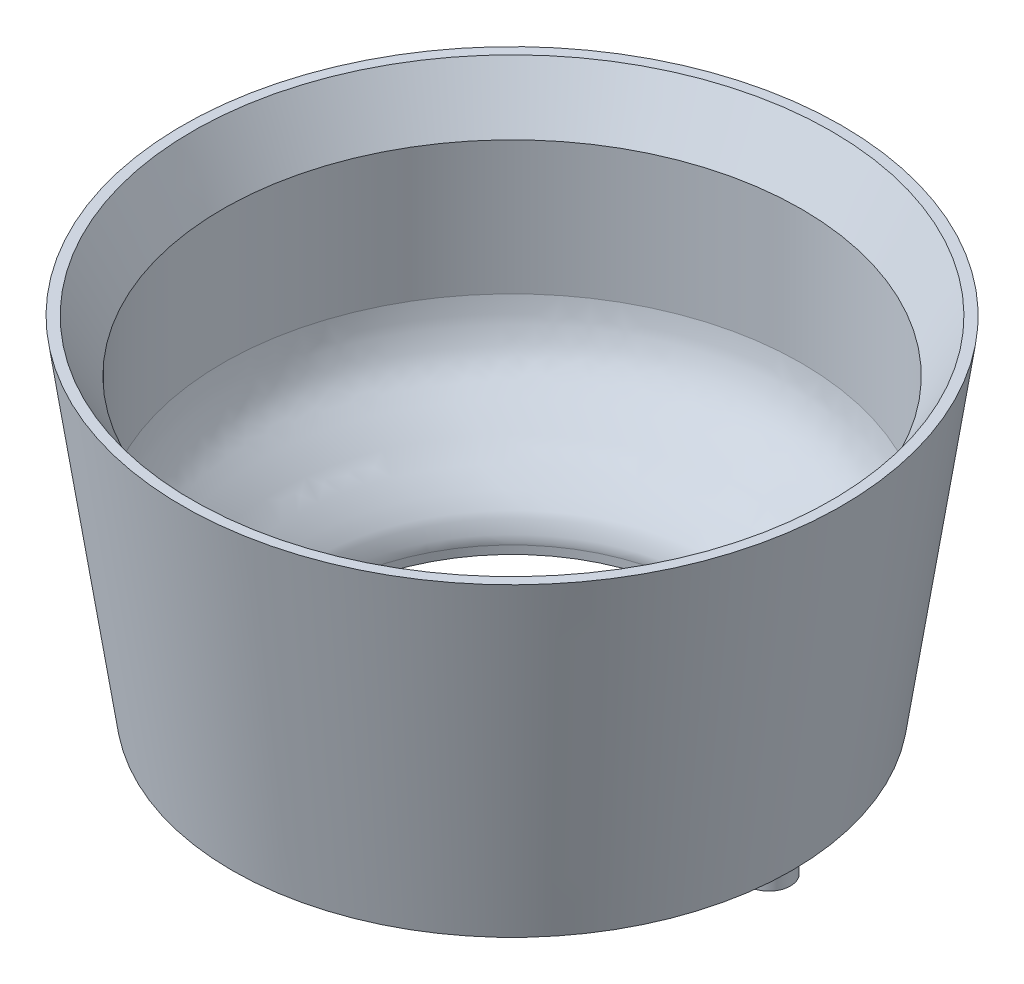
ISO-10303-21;
HEADER;
FILE_DESCRIPTION(('STEP AP214'),'2;1');
FILE_NAME('part.step','',(''),(''),'','','');
FILE_SCHEMA(('AUTOMOTIVE_DESIGN { 1 0 10303 214 1 1 1 1 }'));
ENDSEC;
DATA;
#1=APPLICATION_CONTEXT('core data for automotive mechanical design processes');
#2=APPLICATION_PROTOCOL_DEFINITION('international standard','automotive_design',2000,#1);
#3=PRODUCT_CONTEXT('',#1,'mechanical');
#4=PRODUCT('Part','Part','',(#3));
#5=PRODUCT_RELATED_PRODUCT_CATEGORY('part','',(#4));
#6=PRODUCT_DEFINITION_FORMATION('','',#4);
#7=PRODUCT_DEFINITION_CONTEXT('part definition',#1,'design');
#8=PRODUCT_DEFINITION('design','',#6,#7);
#9=PRODUCT_DEFINITION_SHAPE('','',#8);
#10=(LENGTH_UNIT() NAMED_UNIT(*) SI_UNIT(.MILLI.,.METRE.));
#11=(NAMED_UNIT(*) PLANE_ANGLE_UNIT() SI_UNIT($,.RADIAN.));
#12=(NAMED_UNIT(*) SI_UNIT($,.STERADIAN.) SOLID_ANGLE_UNIT());
#13=UNCERTAINTY_MEASURE_WITH_UNIT(LENGTH_MEASURE(1.E-05),#10,'distance_accuracy_value','');
#14=(GEOMETRIC_REPRESENTATION_CONTEXT(3) GLOBAL_UNCERTAINTY_ASSIGNED_CONTEXT((#13)) GLOBAL_UNIT_ASSIGNED_CONTEXT((#10,
#11,#12)) REPRESENTATION_CONTEXT('',''));
#15=CARTESIAN_POINT('',(0.,0.,0.));
#16=DIRECTION('',(0.,0.,1.));
#17=DIRECTION('',(1.,0.,0.));
#18=AXIS2_PLACEMENT_3D('',#15,#16,#17);
#19=CARTESIAN_POINT('',(0.,295.540718437762,-40.5476747547934));
#20=CARTESIAN_POINT('',(0.,295.012709615636,-40.4477404657415));
#21=CARTESIAN_POINT('',(0.,293.970757618623,-40.2927773525862));
#22=CARTESIAN_POINT('',(0.,292.587532752845,-39.930889754875));
#23=CARTESIAN_POINT('',(0.,291.581451359409,-39.51618641559));
#24=CARTESIAN_POINT('',(0.,290.578047280025,-39.1083707824325));
#25=CARTESIAN_POINT('',(0.,289.316986818185,-38.4396980542591));
#26=CARTESIAN_POINT('',(0.,288.032583078736,-37.3314160861705));
#27=CARTESIAN_POINT('',(0.,287.115418473763,-36.3683638812662));
#28=CARTESIAN_POINT('',(0.,286.340079672536,-35.6302312643945));
#29=CARTESIAN_POINT('',(0.,285.762737125999,-35.0164727262729));
#30=CARTESIAN_POINT('',(0.,285.247169223289,-34.3942597952709));
#31=CARTESIAN_POINT('',(0.,284.556557999368,-33.6355246615368));
#32=CARTESIAN_POINT('',(0.,283.771384037677,-32.9203613336381));
#33=CARTESIAN_POINT('',(0.,282.986073935963,-32.12965190107));
#34=CARTESIAN_POINT('',(0.,282.459482322822,-31.4852417836461));
#35=CARTESIAN_POINT('',(0.,281.963476572773,-30.9149972084707));
#36=CARTESIAN_POINT('',(0.,281.391298158875,-30.3717003462487));
#37=CARTESIAN_POINT('',(0.,280.804626849955,-29.7827961587849));
#38=CARTESIAN_POINT('',(0.,280.262154528045,-29.2275845813112));
#39=CARTESIAN_POINT('',(0.,279.674853681479,-28.7247526180959));
#40=CARTESIAN_POINT('',(0.,279.039651715273,-28.1803862534295));
#41=CARTESIAN_POINT('',(0.,278.470209991792,-27.651838315325));
#42=CARTESIAN_POINT('',(0.,277.876839186641,-27.3081459354535));
#43=CARTESIAN_POINT('',(0.,277.127164256162,-26.9952300805427));
#44=CARTESIAN_POINT('',(0.,276.164510632259,-26.5979526177344));
#45=CARTESIAN_POINT('',(0.,275.470548140668,-26.4648115829165));
#46=CARTESIAN_POINT('',(0.,274.996982716808,-26.5077562004189));
#47=B_SPLINE_CURVE_WITH_KNOTS('',3,(#19,#20,#21,#22,#23,#24,#25,#26,#27,#28,#29,#30,#31,#32,#33,
#34,#35,#36,#37,#38,#39,#40,#41,#42,#43,#44,#45,#46),.UNSPECIFIED.,.F.,.F.,(4,1,1,1,1,1,1,1,1,1,
1,1,1,1,1,1,1,1,1,1,1,1,1,1,1,4),(0.,0.0625440482121128,0.125088096424226,0.156360120530282,
0.187632144636338,0.250176192848451,0.312720241060564,0.375264289272677,0.406536313378733,
0.43780833748479,0.469080361590846,0.500352385696902,0.562896433909015,0.594168458015071,
0.625440482121128,0.656712506227184,0.687984530333241,0.719256554439297,0.750528578545353,
0.78180060265141,0.813072626757466,0.844344650863523,0.875616674969579,0.906888699075636,
0.938160723181692,1.0007047713938),.UNSPECIFIED.);
#48=CARTESIAN_POINT('',(0.,5.,0.));
#49=DIRECTION('',(0.,-1.,0.));
#50=AXIS1_PLACEMENT('',#48,#49);
#51=SURFACE_OF_REVOLUTION('',#47,#50);
#52=CARTESIAN_POINT('',(0.,274.996982716808,8.64791079751593E-13));
#53=DIRECTION('',(0.,-1.,0.));
#54=DIRECTION('',(0.,0.,-1.));
#55=AXIS2_PLACEMENT_3D('',#52,#53,#54);
#56=CIRCLE('',#55,26.5077562004197);
#57=CARTESIAN_POINT('',(0.,274.996982716808,-26.5077562004189));
#58=VERTEX_POINT('',#57);
#59=EDGE_CURVE('E77',#58,#58,#56,.T.);
#60=ORIENTED_EDGE('',*,*,#59,.T.);
#61=EDGE_LOOP('',(#60));
#62=FACE_BOUND('',#61,.T.);
#63=CARTESIAN_POINT('',(0.,295.540718437762,9.30591960996588E-13));
#64=DIRECTION('',(0.,-1.,0.));
#65=DIRECTION('',(0.,0.,-1.));
#66=AXIS2_PLACEMENT_3D('',#63,#64,#65);
#67=CIRCLE('',#66,40.5476747547944);
#68=CARTESIAN_POINT('',(0.,295.540718437762,-40.5476747547934));
#69=VERTEX_POINT('',#68);
#70=EDGE_CURVE('E52',#69,#69,#67,.T.);
#71=ORIENTED_EDGE('',*,*,#70,.F.);
#72=EDGE_LOOP('',(#71));
#73=FACE_BOUND('',#72,.T.);
#74=ADVANCED_FACE('F32',(#62,#73),#51,.F.);
#75=CARTESIAN_POINT('',(0.,5.,0.));
#76=DIRECTION('',(0.,-1.,0.));
#77=DIRECTION('',(0.,0.,-1.));
#78=AXIS2_PLACEMENT_3D('',#75,#76,#77);
#79=CYLINDRICAL_SURFACE('',#78,40.5476747547944);
#80=ORIENTED_EDGE('',*,*,#70,.T.);
#81=EDGE_LOOP('',(#80));
#82=FACE_BOUND('',#81,.T.);
#83=CARTESIAN_POINT('',(0.,314.238618936809,9.90480695303734E-13));
#84=DIRECTION('',(0.,-1.,0.));
#85=DIRECTION('',(0.,0.,-1.));
#86=AXIS2_PLACEMENT_3D('',#83,#84,#85);
#87=CIRCLE('',#86,40.5476747547944);
#88=CARTESIAN_POINT('',(0.,314.238618936809,-40.5476747547934));
#89=VERTEX_POINT('',#88);
#90=EDGE_CURVE('E62',#89,#89,#87,.T.);
#91=ORIENTED_EDGE('',*,*,#90,.F.);
#92=EDGE_LOOP('',(#91));
#93=FACE_BOUND('',#92,.T.);
#94=ADVANCED_FACE('F93',(#82,#93),#79,.F.);
#95=CARTESIAN_POINT('',(0.,321.561079724369,1.01393428618166E-12));
#96=DIRECTION('',(0.,1.,0.));
#97=DIRECTION('',(0.,0.,1.));
#98=AXIS2_PLACEMENT_3D('',#95,#96,#97);
#99=CONICAL_SURFACE('',#98,44.775299461623,0.523598775598309);
#100=ORIENTED_EDGE('',*,*,#90,.T.);
#101=EDGE_LOOP('',(#100));
#102=FACE_BOUND('',#101,.T.);
#103=CARTESIAN_POINT('',(0.,321.561079724369,1.01393428618166E-12));
#104=DIRECTION('',(0.,-1.,0.));
#105=DIRECTION('',(0.,0.,-1.));
#106=AXIS2_PLACEMENT_3D('',#103,#104,#105);
#107=CIRCLE('',#106,44.775299461623);
#108=CARTESIAN_POINT('',(0.,321.561079724369,-44.775299461622));
#109=VERTEX_POINT('',#108);
#110=EDGE_CURVE('E65',#109,#109,#107,.T.);
#111=ORIENTED_EDGE('',*,*,#110,.F.);
#112=EDGE_LOOP('',(#111));
#113=FACE_BOUND('',#112,.T.);
#114=ADVANCED_FACE('F179',(#102,#113),#99,.F.);
#115=CARTESIAN_POINT('',(0.,321.561079724369,-44.775299461622));
#116=DIRECTION('',(0.,1.,0.));
#117=DIRECTION('',(0.,0.,1.));
#118=AXIS2_PLACEMENT_3D('',#115,#116,#117);
#119=PLANE('',#118);
#120=ORIENTED_EDGE('',*,*,#110,.T.);
#121=EDGE_LOOP('',(#120));
#122=FACE_BOUND('',#121,.T.);
#123=CARTESIAN_POINT('',(0.,321.561079724369,1.01393428618166E-12));
#124=DIRECTION('',(0.,-1.,0.));
#125=DIRECTION('',(0.,0.,-1.));
#126=AXIS2_PLACEMENT_3D('',#123,#124,#125);
#127=CIRCLE('',#126,46.181267187361);
#128=CARTESIAN_POINT('',(0.,321.561079724369,-46.1812671873599));
#129=VERTEX_POINT('',#128);
#130=EDGE_CURVE('E68',#129,#129,#127,.T.);
#131=ORIENTED_EDGE('',*,*,#130,.F.);
#132=EDGE_LOOP('',(#131));
#133=FACE_BOUND('',#132,.T.);
#134=ADVANCED_FACE('F176',(#122,#133),#119,.T.);
#135=CARTESIAN_POINT('',(0.,273.84861893681,8.61112909931847E-13));
#136=DIRECTION('',(0.,1.,0.));
#137=DIRECTION('',(0.,0.,1.));
#138=AXIS2_PLACEMENT_3D('',#135,#136,#137);
#139=CONICAL_SURFACE('',#138,39.2207719119618,0.144862327915536);
#140=ORIENTED_EDGE('',*,*,#130,.T.);
#141=EDGE_LOOP('',(#140));
#142=FACE_BOUND('',#141,.T.);
#143=CARTESIAN_POINT('',(0.,273.84861893681,8.61112909931847E-13));
#144=DIRECTION('',(0.,-1.,0.));
#145=DIRECTION('',(0.,0.,-1.));
#146=AXIS2_PLACEMENT_3D('',#143,#144,#145);
#147=CIRCLE('',#146,39.2207719119618);
#148=CARTESIAN_POINT('',(0.,273.84861893681,-39.2207719119609));
#149=VERTEX_POINT('',#148);
#150=EDGE_CURVE('E71',#149,#149,#147,.T.);
#151=ORIENTED_EDGE('',*,*,#150,.F.);
#152=EDGE_LOOP('',(#151));
#153=FACE_BOUND('',#152,.T.);
#154=ADVANCED_FACE('F172',(#142,#153),#139,.T.);
#155=CARTESIAN_POINT('',(0.,273.84861893681,-39.2207719119609));
#156=DIRECTION('',(0.,-1.,0.));
#157=DIRECTION('',(0.,0.,-1.));
#158=AXIS2_PLACEMENT_3D('',#155,#156,#157);
#159=PLANE('',#158);
#160=CARTESIAN_POINT('',(36.,273.84861893681,8.77127738524554E-13));
#161=DIRECTION('',(0.,-1.,0.));
#162=DIRECTION('',(0.,0.,-1.));
#163=AXIS2_PLACEMENT_3D('',#160,#161,#162);
#164=CIRCLE('',#163,3.);
#165=CARTESIAN_POINT('',(36.,273.84861893681,-2.99999999999912));
#166=VERTEX_POINT('',#165);
#167=EDGE_CURVE('E123',#166,#166,#164,.T.);
#168=ORIENTED_EDGE('',*,*,#167,.F.);
#169=EDGE_LOOP('',(#168));
#170=FACE_BOUND('',#169,.T.);
#171=CARTESIAN_POINT('',(-31.1769145362399,273.84861893681,18.0000000000007));
#172=DIRECTION('',(0.,-1.,0.));
#173=DIRECTION('',(0.,0.,-1.));
#174=AXIS2_PLACEMENT_3D('',#171,#172,#173);
#175=CIRCLE('',#174,3.);
#176=CARTESIAN_POINT('',(-31.1769145362399,273.84861893681,15.0000000000007));
#177=VERTEX_POINT('',#176);
#178=EDGE_CURVE('E85',#177,#177,#175,.T.);
#179=ORIENTED_EDGE('',*,*,#178,.F.);
#180=EDGE_LOOP('',(#179));
#181=FACE_BOUND('',#180,.T.);
#182=ORIENTED_EDGE('',*,*,#150,.T.);
#183=EDGE_LOOP('',(#182));
#184=FACE_BOUND('',#183,.T.);
#185=CARTESIAN_POINT('',(0.,273.84861893681,8.61112909931847E-13));
#186=DIRECTION('',(0.,-1.,0.));
#187=DIRECTION('',(0.,0.,-1.));
#188=AXIS2_PLACEMENT_3D('',#185,#186,#187);
#189=CIRCLE('',#188,26.5077562004196);
#190=CARTESIAN_POINT('',(0.,273.84861893681,-26.5077562004188));
#191=VERTEX_POINT('',#190);
#192=EDGE_CURVE('E74',#191,#191,#189,.T.);
#193=ORIENTED_EDGE('',*,*,#192,.F.);
#194=EDGE_LOOP('',(#193));
#195=FACE_BOUND('',#194,.T.);
#196=ADVANCED_FACE('F168',(#170,#181,#184,#195),#159,.T.);
#197=CARTESIAN_POINT('',(0.,5.,0.));
#198=DIRECTION('',(0.,-1.,0.));
#199=DIRECTION('',(0.,0.,-1.));
#200=AXIS2_PLACEMENT_3D('',#197,#198,#199);
#201=CYLINDRICAL_SURFACE('',#200,26.5077562004197);
#202=ORIENTED_EDGE('',*,*,#192,.T.);
#203=EDGE_LOOP('',(#202));
#204=FACE_BOUND('',#203,.T.);
#205=ORIENTED_EDGE('',*,*,#59,.F.);
#206=EDGE_LOOP('',(#205));
#207=FACE_BOUND('',#206,.T.);
#208=ADVANCED_FACE('F165',(#204,#207),#201,.F.);
#209=CARTESIAN_POINT('',(-31.1769145362399,271.84861893681,18.0000000000007));
#210=DIRECTION('',(0.,1.,0.));
#211=DIRECTION('',(0.,0.,1.));
#212=AXIS2_PLACEMENT_3D('',#209,#210,#211);
#213=CYLINDRICAL_SURFACE('',#212,3.);
#214=CARTESIAN_POINT('',(-31.1769145362399,271.84861893681,18.0000000000007));
#215=DIRECTION('',(0.,-1.,0.));
#216=DIRECTION('',(0.,0.,-1.));
#217=AXIS2_PLACEMENT_3D('',#214,#215,#216);
#218=CIRCLE('',#217,3.);
#219=CARTESIAN_POINT('',(-31.1769145362399,271.84861893681,15.0000000000007));
#220=VERTEX_POINT('',#219);
#221=EDGE_CURVE('E80',#220,#220,#218,.T.);
#222=ORIENTED_EDGE('',*,*,#221,.F.);
#223=EDGE_LOOP('',(#222));
#224=FACE_BOUND('',#223,.T.);
#225=ORIENTED_EDGE('',*,*,#178,.T.);
#226=EDGE_LOOP('',(#225));
#227=FACE_BOUND('',#226,.T.);
#228=ADVANCED_FACE('F115',(#224,#227),#213,.T.);
#229=CARTESIAN_POINT('',(-31.1769145362399,271.84861893681,18.0000000000007));
#230=DIRECTION('',(0.,-1.,0.));
#231=DIRECTION('',(0.,0.,-1.));
#232=AXIS2_PLACEMENT_3D('',#229,#230,#231);
#233=PLANE('',#232);
#234=CARTESIAN_POINT('',(-31.1769145362399,271.84861893681,18.0000000000007));
#235=DIRECTION('',(0.,-1.,0.));
#236=DIRECTION('',(0.,0.,-1.));
#237=AXIS2_PLACEMENT_3D('',#234,#235,#236);
#238=CIRCLE('',#237,2.55);
#239=CARTESIAN_POINT('',(-31.1769145362399,271.84861893681,15.4500000000007));
#240=VERTEX_POINT('',#239);
#241=EDGE_CURVE('E47',#240,#240,#238,.F.);
#242=ORIENTED_EDGE('',*,*,#241,.T.);
#243=EDGE_LOOP('',(#242));
#244=FACE_BOUND('',#243,.T.);
#245=ORIENTED_EDGE('',*,*,#221,.T.);
#246=EDGE_LOOP('',(#245));
#247=FACE_BOUND('',#246,.T.);
#248=ADVANCED_FACE('F111',(#244,#247),#233,.T.);
#249=CARTESIAN_POINT('',(36.,271.84861893681,8.70721807087471E-13));
#250=DIRECTION('',(0.,1.,0.));
#251=DIRECTION('',(0.,0.,1.));
#252=AXIS2_PLACEMENT_3D('',#249,#250,#251);
#253=CYLINDRICAL_SURFACE('',#252,3.);
#254=CARTESIAN_POINT('',(36.,271.84861893681,8.70721807087471E-13));
#255=DIRECTION('',(0.,-1.,0.));
#256=DIRECTION('',(0.,0.,-1.));
#257=AXIS2_PLACEMENT_3D('',#254,#255,#256);
#258=CIRCLE('',#257,3.);
#259=CARTESIAN_POINT('',(36.,271.84861893681,-2.99999999999913));
#260=VERTEX_POINT('',#259);
#261=EDGE_CURVE('E121',#260,#260,#258,.T.);
#262=ORIENTED_EDGE('',*,*,#261,.F.);
#263=EDGE_LOOP('',(#262));
#264=FACE_BOUND('',#263,.T.);
#265=ORIENTED_EDGE('',*,*,#167,.T.);
#266=EDGE_LOOP('',(#265));
#267=FACE_BOUND('',#266,.T.);
#268=ADVANCED_FACE('F114',(#264,#267),#253,.T.);
#269=CARTESIAN_POINT('',(36.,271.84861893681,8.70721807087471E-13));
#270=DIRECTION('',(0.,-1.,0.));
#271=DIRECTION('',(0.,0.,-1.));
#272=AXIS2_PLACEMENT_3D('',#269,#270,#271);
#273=PLANE('',#272);
#274=CARTESIAN_POINT('',(36.,271.84861893681,8.70721807087471E-13));
#275=DIRECTION('',(0.,-1.,0.));
#276=DIRECTION('',(0.,0.,-1.));
#277=AXIS2_PLACEMENT_3D('',#274,#275,#276);
#278=CIRCLE('',#277,2.55000000000001);
#279=CARTESIAN_POINT('',(36.,271.84861893681,-2.54999999999914));
#280=VERTEX_POINT('',#279);
#281=EDGE_CURVE('E43',#280,#280,#278,.F.);
#282=ORIENTED_EDGE('',*,*,#281,.T.);
#283=EDGE_LOOP('',(#282));
#284=FACE_BOUND('',#283,.T.);
#285=ORIENTED_EDGE('',*,*,#261,.T.);
#286=EDGE_LOOP('',(#285));
#287=FACE_BOUND('',#286,.T.);
#288=ADVANCED_FACE('F149',(#284,#287),#273,.T.);
#289=CARTESIAN_POINT('',(-31.1769145362399,272.34861893681,18.0000000000007));
#290=DIRECTION('',(0.,-1.,0.));
#291=DIRECTION('',(0.,0.,-1.));
#292=AXIS2_PLACEMENT_3D('',#289,#290,#291);
#293=PLANE('',#292);
#294=CARTESIAN_POINT('',(-31.1769145362399,272.34861893681,18.0000000000007));
#295=DIRECTION('',(0.,-1.,0.));
#296=DIRECTION('',(0.,0.,-1.));
#297=AXIS2_PLACEMENT_3D('',#294,#295,#296);
#298=CIRCLE('',#297,2.05);
#299=CARTESIAN_POINT('',(-31.1769145362399,272.34861893681,15.9500000000007));
#300=VERTEX_POINT('',#299);
#301=EDGE_CURVE('E39',#300,#300,#298,.T.);
#302=ORIENTED_EDGE('',*,*,#301,.T.);
#303=EDGE_LOOP('',(#302));
#304=FACE_BOUND('',#303,.T.);
#305=CARTESIAN_POINT('',(-31.1769145362399,272.34861893681,18.0000000000007));
#306=DIRECTION('',(0.,-1.,0.));
#307=DIRECTION('',(0.,0.,-1.));
#308=AXIS2_PLACEMENT_3D('',#305,#306,#307);
#309=CIRCLE('',#308,1.5);
#310=CARTESIAN_POINT('',(-31.1769145362399,272.34861893681,16.5000000000007));
#311=VERTEX_POINT('',#310);
#312=EDGE_CURVE('E57',#311,#311,#309,.F.);
#313=ORIENTED_EDGE('',*,*,#312,.T.);
#314=EDGE_LOOP('',(#313));
#315=FACE_BOUND('',#314,.T.);
#316=ADVANCED_FACE('F140',(#304,#315),#293,.T.);
#317=CARTESIAN_POINT('',(36.,272.34861893681,8.72323289946742E-13));
#318=DIRECTION('',(0.,-1.,0.));
#319=DIRECTION('',(0.,0.,-1.));
#320=AXIS2_PLACEMENT_3D('',#317,#318,#319);
#321=PLANE('',#320);
#322=CARTESIAN_POINT('',(36.,272.34861893681,8.72323289946742E-13));
#323=DIRECTION('',(0.,-1.,0.));
#324=DIRECTION('',(0.,0.,-1.));
#325=AXIS2_PLACEMENT_3D('',#322,#323,#324);
#326=CIRCLE('',#325,2.05);
#327=CARTESIAN_POINT('',(36.,272.34861893681,-2.04999999999913));
#328=VERTEX_POINT('',#327);
#329=EDGE_CURVE('E10',#328,#328,#326,.T.);
#330=ORIENTED_EDGE('',*,*,#329,.T.);
#331=EDGE_LOOP('',(#330));
#332=FACE_BOUND('',#331,.T.);
#333=CARTESIAN_POINT('',(36.,272.34861893681,8.72323289946742E-13));
#334=DIRECTION('',(0.,-1.,0.));
#335=DIRECTION('',(0.,0.,-1.));
#336=AXIS2_PLACEMENT_3D('',#333,#334,#335);
#337=CIRCLE('',#336,1.5);
#338=CARTESIAN_POINT('',(36.,272.34861893681,-1.49999999999913));
#339=VERTEX_POINT('',#338);
#340=EDGE_CURVE('E53',#339,#339,#337,.F.);
#341=ORIENTED_EDGE('',*,*,#340,.T.);
#342=EDGE_LOOP('',(#341));
#343=FACE_BOUND('',#342,.T.);
#344=ADVANCED_FACE('F137',(#332,#343),#321,.T.);
#345=CARTESIAN_POINT('',(-31.1769145362399,277.84861893681,18.0000000000007));
#346=DIRECTION('',(0.,-1.,0.));
#347=DIRECTION('',(0.,0.,-1.));
#348=AXIS2_PLACEMENT_3D('',#345,#346,#347);
#349=PLANE('',#348);
#350=CARTESIAN_POINT('',(-31.1769145362399,277.84861893681,18.0000000000007));
#351=DIRECTION('',(0.,-1.,0.));
#352=DIRECTION('',(0.,0.,-1.));
#353=AXIS2_PLACEMENT_3D('',#350,#351,#352);
#354=CIRCLE('',#353,1.5);
#355=CARTESIAN_POINT('',(-31.1769145362399,277.84861893681,16.5000000000007));
#356=VERTEX_POINT('',#355);
#357=EDGE_CURVE('E56',#356,#356,#354,.T.);
#358=ORIENTED_EDGE('',*,*,#357,.T.);
#359=EDGE_LOOP('',(#358));
#360=FACE_BOUND('',#359,.T.);
#361=ADVANCED_FACE('F139',(#360),#349,.T.);
#362=CARTESIAN_POINT('',(-31.1769145362399,277.84861893681,18.0000000000007));
#363=DIRECTION('',(0.,-1.,0.));
#364=DIRECTION('',(0.,0.,-1.));
#365=AXIS2_PLACEMENT_3D('',#362,#363,#364);
#366=CYLINDRICAL_SURFACE('',#365,1.5);
#367=ORIENTED_EDGE('',*,*,#357,.F.);
#368=EDGE_LOOP('',(#367));
#369=FACE_BOUND('',#368,.T.);
#370=ORIENTED_EDGE('',*,*,#312,.F.);
#371=EDGE_LOOP('',(#370));
#372=FACE_BOUND('',#371,.T.);
#373=ADVANCED_FACE('F146',(#369,#372),#366,.F.);
#374=CARTESIAN_POINT('',(36.,277.84861893681,8.89939601398721E-13));
#375=DIRECTION('',(0.,-1.,0.));
#376=DIRECTION('',(0.,0.,-1.));
#377=AXIS2_PLACEMENT_3D('',#374,#375,#376);
#378=PLANE('',#377);
#379=CARTESIAN_POINT('',(36.,277.84861893681,8.89939601398721E-13));
#380=DIRECTION('',(0.,-1.,0.));
#381=DIRECTION('',(0.,0.,-1.));
#382=AXIS2_PLACEMENT_3D('',#379,#380,#381);
#383=CIRCLE('',#382,1.5);
#384=CARTESIAN_POINT('',(36.,277.84861893681,-1.49999999999911));
#385=VERTEX_POINT('',#384);
#386=EDGE_CURVE('E126',#385,#385,#383,.T.);
#387=ORIENTED_EDGE('',*,*,#386,.T.);
#388=EDGE_LOOP('',(#387));
#389=FACE_BOUND('',#388,.T.);
#390=ADVANCED_FACE('F105',(#389),#378,.T.);
#391=CARTESIAN_POINT('',(36.,277.84861893681,8.89939601398721E-13));
#392=DIRECTION('',(0.,-1.,0.));
#393=DIRECTION('',(0.,0.,-1.));
#394=AXIS2_PLACEMENT_3D('',#391,#392,#393);
#395=CYLINDRICAL_SURFACE('',#394,1.5);
#396=ORIENTED_EDGE('',*,*,#386,.F.);
#397=EDGE_LOOP('',(#396));
#398=FACE_BOUND('',#397,.T.);
#399=ORIENTED_EDGE('',*,*,#340,.F.);
#400=EDGE_LOOP('',(#399));
#401=FACE_BOUND('',#400,.T.);
#402=ADVANCED_FACE('F98',(#398,#401),#395,.F.);
#403=CARTESIAN_POINT('',(-31.1769145362399,272.39861893681,18.0000000000007));
#404=DIRECTION('',(0.,-1.,0.));
#405=DIRECTION('',(0.,0.,-1.));
#406=AXIS2_PLACEMENT_3D('',#403,#404,#405);
#407=CONICAL_SURFACE('',#406,2.,0.785398163397455);
#408=ORIENTED_EDGE('',*,*,#241,.F.);
#409=EDGE_LOOP('',(#408));
#410=FACE_BOUND('',#409,.T.);
#411=ORIENTED_EDGE('',*,*,#301,.F.);
#412=EDGE_LOOP('',(#411));
#413=FACE_BOUND('',#412,.T.);
#414=ADVANCED_FACE('F96',(#410,#413),#407,.F.);
#415=CARTESIAN_POINT('',(36.,272.39861893681,8.72483438232669E-13));
#416=DIRECTION('',(0.,-1.,0.));
#417=DIRECTION('',(0.,0.,-1.));
#418=AXIS2_PLACEMENT_3D('',#415,#416,#417);
#419=CONICAL_SURFACE('',#418,2.,0.785398163397457);
#420=ORIENTED_EDGE('',*,*,#281,.F.);
#421=EDGE_LOOP('',(#420));
#422=FACE_BOUND('',#421,.T.);
#423=ORIENTED_EDGE('',*,*,#329,.F.);
#424=EDGE_LOOP('',(#423));
#425=FACE_BOUND('',#424,.T.);
#426=ADVANCED_FACE('F34',(#422,#425),#419,.F.);
#427=CLOSED_SHELL('',(#74,#94,#114,#134,#154,#196,#208,#228,#248,#268,#288,#316,#344,#361,#373,
#390,#402,#414,#426));
#428=MANIFOLD_SOLID_BREP('B2',#427);
#429=ADVANCED_BREP_SHAPE_REPRESENTATION('',(#18,#428),#14);
#430=SHAPE_DEFINITION_REPRESENTATION(#9,#429);
ENDSEC;
END-ISO-10303-21;
